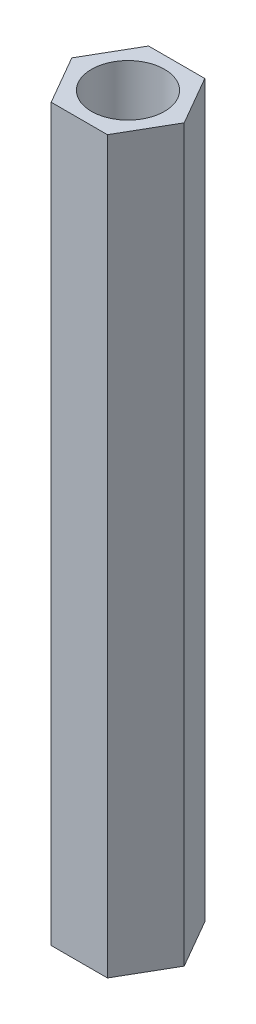
ISO-10303-21;
HEADER;
FILE_DESCRIPTION(('STEP AP214'),'2;1');
FILE_NAME('part.step','',(''),(''),'','','');
FILE_SCHEMA(('AUTOMOTIVE_DESIGN { 1 0 10303 214 1 1 1 1 }'));
ENDSEC;
DATA;
#1=APPLICATION_CONTEXT('core data for automotive mechanical design processes');
#2=APPLICATION_PROTOCOL_DEFINITION('international standard','automotive_design',2000,#1);
#3=PRODUCT_CONTEXT('',#1,'mechanical');
#4=PRODUCT('Part','Part','',(#3));
#5=PRODUCT_RELATED_PRODUCT_CATEGORY('part','',(#4));
#6=PRODUCT_DEFINITION_FORMATION('','',#4);
#7=PRODUCT_DEFINITION_CONTEXT('part definition',#1,'design');
#8=PRODUCT_DEFINITION('design','',#6,#7);
#9=PRODUCT_DEFINITION_SHAPE('','',#8);
#10=(LENGTH_UNIT() NAMED_UNIT(*) SI_UNIT(.MILLI.,.METRE.));
#11=(NAMED_UNIT(*) PLANE_ANGLE_UNIT() SI_UNIT($,.RADIAN.));
#12=(NAMED_UNIT(*) SI_UNIT($,.STERADIAN.) SOLID_ANGLE_UNIT());
#13=UNCERTAINTY_MEASURE_WITH_UNIT(LENGTH_MEASURE(1.E-05),#10,'distance_accuracy_value','');
#14=(GEOMETRIC_REPRESENTATION_CONTEXT(3) GLOBAL_UNCERTAINTY_ASSIGNED_CONTEXT((#13)) GLOBAL_UNIT_ASSIGNED_CONTEXT((#10,
#11,#12)) REPRESENTATION_CONTEXT('',''));
#15=CARTESIAN_POINT('',(0.,0.,0.));
#16=DIRECTION('',(0.,0.,1.));
#17=DIRECTION('',(1.,0.,0.));
#18=AXIS2_PLACEMENT_3D('',#15,#16,#17);
#19=CARTESIAN_POINT('',(0.,30.,0.));
#20=DIRECTION('',(0.,1.,0.));
#21=DIRECTION('',(0.,0.,1.));
#22=AXIS2_PLACEMENT_3D('',#19,#20,#21);
#23=PLANE('',#22);
#24=DIRECTION('',(0.5,0.,-0.866025403784439));
#25=VECTOR('',#24,1.);
#26=CARTESIAN_POINT('',(1.15470053837925,30.,2.));
#27=LINE('',#26,#25);
#28=CARTESIAN_POINT('',(1.15470053837925,30.,2.));
#29=VERTEX_POINT('',#28);
#30=CARTESIAN_POINT('',(2.3094010767585,30.,0.));
#31=VERTEX_POINT('',#30);
#32=EDGE_CURVE('E133',#29,#31,#27,.T.);
#33=ORIENTED_EDGE('',*,*,#32,.T.);
#34=DIRECTION('',(-0.5,0.,-0.866025403784439));
#35=VECTOR('',#34,1.);
#36=CARTESIAN_POINT('',(2.3094010767585,30.,0.));
#37=LINE('',#36,#35);
#38=CARTESIAN_POINT('',(1.15470053837925,30.,-2.));
#39=VERTEX_POINT('',#38);
#40=EDGE_CURVE('E91',#31,#39,#37,.T.);
#41=ORIENTED_EDGE('',*,*,#40,.T.);
#42=DIRECTION('',(-1.,0.,0.));
#43=VECTOR('',#42,1.);
#44=CARTESIAN_POINT('',(1.15470053837925,30.,-2.));
#45=LINE('',#44,#43);
#46=CARTESIAN_POINT('',(-1.15470053837925,30.,-2.));
#47=VERTEX_POINT('',#46);
#48=EDGE_CURVE('E104',#39,#47,#45,.T.);
#49=ORIENTED_EDGE('',*,*,#48,.T.);
#50=DIRECTION('',(-0.5,0.,0.866025403784439));
#51=VECTOR('',#50,1.);
#52=CARTESIAN_POINT('',(-1.15470053837925,30.,-2.));
#53=LINE('',#52,#51);
#54=CARTESIAN_POINT('',(-2.3094010767585,30.,0.));
#55=VERTEX_POINT('',#54);
#56=EDGE_CURVE('E98',#47,#55,#53,.T.);
#57=ORIENTED_EDGE('',*,*,#56,.T.);
#58=DIRECTION('',(0.5,0.,0.866025403784439));
#59=VECTOR('',#58,1.);
#60=CARTESIAN_POINT('',(-2.3094010767585,30.,0.));
#61=LINE('',#60,#59);
#62=CARTESIAN_POINT('',(-1.15470053837925,30.,2.));
#63=VERTEX_POINT('',#62);
#64=EDGE_CURVE('E102',#55,#63,#61,.T.);
#65=ORIENTED_EDGE('',*,*,#64,.T.);
#66=DIRECTION('',(1.,0.,0.));
#67=VECTOR('',#66,1.);
#68=CARTESIAN_POINT('',(-1.15470053837925,30.,2.));
#69=LINE('',#68,#67);
#70=EDGE_CURVE('E54',#63,#29,#69,.T.);
#71=ORIENTED_EDGE('',*,*,#70,.T.);
#72=EDGE_LOOP('',(#33,#41,#49,#57,#65,#71));
#73=FACE_BOUND('',#72,.T.);
#74=CARTESIAN_POINT('',(0.,30.,0.));
#75=DIRECTION('',(0.,1.,0.));
#76=DIRECTION('',(0.,0.,1.));
#77=AXIS2_PLACEMENT_3D('',#74,#75,#76);
#78=CIRCLE('',#77,1.5);
#79=CARTESIAN_POINT('',(0.,30.,1.5));
#80=VERTEX_POINT('',#79);
#81=EDGE_CURVE('E126',#80,#80,#78,.T.);
#82=ORIENTED_EDGE('',*,*,#81,.F.);
#83=EDGE_LOOP('',(#82));
#84=FACE_BOUND('',#83,.T.);
#85=ADVANCED_FACE('F37',(#73,#84),#23,.T.);
#86=CARTESIAN_POINT('',(0.,0.,0.));
#87=DIRECTION('',(0.,1.,0.));
#88=DIRECTION('',(0.,0.,1.));
#89=AXIS2_PLACEMENT_3D('',#86,#87,#88);
#90=PLANE('',#89);
#91=DIRECTION('',(0.5,0.,-0.866025403784439));
#92=VECTOR('',#91,1.);
#93=CARTESIAN_POINT('',(1.15470053837925,0.,2.));
#94=LINE('',#93,#92);
#95=CARTESIAN_POINT('',(1.15470053837925,0.,2.));
#96=VERTEX_POINT('',#95);
#97=CARTESIAN_POINT('',(2.3094010767585,0.,0.));
#98=VERTEX_POINT('',#97);
#99=EDGE_CURVE('E122',#96,#98,#94,.T.);
#100=ORIENTED_EDGE('',*,*,#99,.F.);
#101=DIRECTION('',(1.,0.,0.));
#102=VECTOR('',#101,1.);
#103=CARTESIAN_POINT('',(-1.15470053837925,0.,2.));
#104=LINE('',#103,#102);
#105=CARTESIAN_POINT('',(-1.15470053837925,0.,2.));
#106=VERTEX_POINT('',#105);
#107=EDGE_CURVE('E83',#106,#96,#104,.T.);
#108=ORIENTED_EDGE('',*,*,#107,.F.);
#109=DIRECTION('',(0.5,0.,0.866025403784439));
#110=VECTOR('',#109,1.);
#111=CARTESIAN_POINT('',(-2.3094010767585,0.,0.));
#112=LINE('',#111,#110);
#113=CARTESIAN_POINT('',(-2.3094010767585,0.,0.));
#114=VERTEX_POINT('',#113);
#115=EDGE_CURVE('E77',#114,#106,#112,.T.);
#116=ORIENTED_EDGE('',*,*,#115,.F.);
#117=DIRECTION('',(-0.5,0.,0.866025403784439));
#118=VECTOR('',#117,1.);
#119=CARTESIAN_POINT('',(-1.15470053837925,0.,-2.));
#120=LINE('',#119,#118);
#121=CARTESIAN_POINT('',(-1.15470053837925,0.,-2.));
#122=VERTEX_POINT('',#121);
#123=EDGE_CURVE('E112',#122,#114,#120,.T.);
#124=ORIENTED_EDGE('',*,*,#123,.F.);
#125=DIRECTION('',(-1.,0.,0.));
#126=VECTOR('',#125,1.);
#127=CARTESIAN_POINT('',(1.15470053837925,0.,-2.));
#128=LINE('',#127,#126);
#129=CARTESIAN_POINT('',(1.15470053837925,0.,-2.));
#130=VERTEX_POINT('',#129);
#131=EDGE_CURVE('E128',#130,#122,#128,.T.);
#132=ORIENTED_EDGE('',*,*,#131,.F.);
#133=DIRECTION('',(-0.5,0.,-0.866025403784439));
#134=VECTOR('',#133,1.);
#135=CARTESIAN_POINT('',(2.3094010767585,0.,0.));
#136=LINE('',#135,#134);
#137=EDGE_CURVE('E125',#98,#130,#136,.T.);
#138=ORIENTED_EDGE('',*,*,#137,.F.);
#139=EDGE_LOOP('',(#100,#108,#116,#124,#132,#138));
#140=FACE_BOUND('',#139,.T.);
#141=CARTESIAN_POINT('',(0.,0.,0.));
#142=DIRECTION('',(0.,1.,0.));
#143=DIRECTION('',(0.,0.,1.));
#144=AXIS2_PLACEMENT_3D('',#141,#142,#143);
#145=CIRCLE('',#144,1.5);
#146=CARTESIAN_POINT('',(0.,0.,1.5));
#147=VERTEX_POINT('',#146);
#148=EDGE_CURVE('E226',#147,#147,#145,.T.);
#149=ORIENTED_EDGE('',*,*,#148,.T.);
#150=EDGE_LOOP('',(#149));
#151=FACE_BOUND('',#150,.T.);
#152=ADVANCED_FACE('F142',(#140,#151),#90,.F.);
#153=CARTESIAN_POINT('',(1.15470053837925,30.,2.));
#154=DIRECTION('',(-0.866025403784439,0.,-0.5));
#155=DIRECTION('',(-0.5,0.,0.866025403784439));
#156=AXIS2_PLACEMENT_3D('',#153,#154,#155);
#157=PLANE('',#156);
#158=ORIENTED_EDGE('',*,*,#99,.T.);
#159=DIRECTION('',(0.,-1.,0.));
#160=VECTOR('',#159,1.);
#161=CARTESIAN_POINT('',(2.3094010767585,30.,0.));
#162=LINE('',#161,#160);
#163=EDGE_CURVE('E11',#31,#98,#162,.T.);
#164=ORIENTED_EDGE('',*,*,#163,.F.);
#165=ORIENTED_EDGE('',*,*,#32,.F.);
#166=DIRECTION('',(0.,-1.,0.));
#167=VECTOR('',#166,1.);
#168=CARTESIAN_POINT('',(1.15470053837925,30.,2.));
#169=LINE('',#168,#167);
#170=EDGE_CURVE('E118',#29,#96,#169,.T.);
#171=ORIENTED_EDGE('',*,*,#170,.T.);
#172=EDGE_LOOP('',(#158,#164,#165,#171));
#173=FACE_BOUND('',#172,.T.);
#174=ADVANCED_FACE('F39',(#173),#157,.F.);
#175=CARTESIAN_POINT('',(2.3094010767585,30.,0.));
#176=DIRECTION('',(-0.866025403784439,0.,0.5));
#177=DIRECTION('',(0.5,0.,0.866025403784439));
#178=AXIS2_PLACEMENT_3D('',#175,#176,#177);
#179=PLANE('',#178);
#180=ORIENTED_EDGE('',*,*,#137,.T.);
#181=DIRECTION('',(0.,-1.,0.));
#182=VECTOR('',#181,1.);
#183=CARTESIAN_POINT('',(1.15470053837925,30.,-2.));
#184=LINE('',#183,#182);
#185=EDGE_CURVE('E46',#39,#130,#184,.T.);
#186=ORIENTED_EDGE('',*,*,#185,.F.);
#187=ORIENTED_EDGE('',*,*,#40,.F.);
#188=ORIENTED_EDGE('',*,*,#163,.T.);
#189=EDGE_LOOP('',(#180,#186,#187,#188));
#190=FACE_BOUND('',#189,.T.);
#191=ADVANCED_FACE('F167',(#190),#179,.F.);
#192=CARTESIAN_POINT('',(1.15470053837925,30.,-2.));
#193=DIRECTION('',(0.,0.,1.));
#194=DIRECTION('',(1.,0.,0.));
#195=AXIS2_PLACEMENT_3D('',#192,#193,#194);
#196=PLANE('',#195);
#197=ORIENTED_EDGE('',*,*,#131,.T.);
#198=DIRECTION('',(0.,-1.,0.));
#199=VECTOR('',#198,1.);
#200=CARTESIAN_POINT('',(-1.15470053837925,30.,-2.));
#201=LINE('',#200,#199);
#202=EDGE_CURVE('E113',#47,#122,#201,.T.);
#203=ORIENTED_EDGE('',*,*,#202,.F.);
#204=ORIENTED_EDGE('',*,*,#48,.F.);
#205=ORIENTED_EDGE('',*,*,#185,.T.);
#206=EDGE_LOOP('',(#197,#203,#204,#205));
#207=FACE_BOUND('',#206,.T.);
#208=ADVANCED_FACE('F139',(#207),#196,.F.);
#209=CARTESIAN_POINT('',(-1.15470053837925,30.,-2.));
#210=DIRECTION('',(0.866025403784439,0.,0.5));
#211=DIRECTION('',(0.5,0.,-0.866025403784439));
#212=AXIS2_PLACEMENT_3D('',#209,#210,#211);
#213=PLANE('',#212);
#214=ORIENTED_EDGE('',*,*,#123,.T.);
#215=DIRECTION('',(0.,-1.,0.));
#216=VECTOR('',#215,1.);
#217=CARTESIAN_POINT('',(-2.3094010767585,30.,0.));
#218=LINE('',#217,#216);
#219=EDGE_CURVE('E109',#55,#114,#218,.T.);
#220=ORIENTED_EDGE('',*,*,#219,.F.);
#221=ORIENTED_EDGE('',*,*,#56,.F.);
#222=ORIENTED_EDGE('',*,*,#202,.T.);
#223=EDGE_LOOP('',(#214,#220,#221,#222));
#224=FACE_BOUND('',#223,.T.);
#225=ADVANCED_FACE('F110',(#224),#213,.F.);
#226=CARTESIAN_POINT('',(-2.3094010767585,30.,0.));
#227=DIRECTION('',(0.866025403784439,0.,-0.5));
#228=DIRECTION('',(-0.5,0.,-0.866025403784439));
#229=AXIS2_PLACEMENT_3D('',#226,#227,#228);
#230=PLANE('',#229);
#231=ORIENTED_EDGE('',*,*,#115,.T.);
#232=DIRECTION('',(0.,-1.,0.));
#233=VECTOR('',#232,1.);
#234=CARTESIAN_POINT('',(-1.15470053837925,30.,2.));
#235=LINE('',#234,#233);
#236=EDGE_CURVE('E114',#63,#106,#235,.T.);
#237=ORIENTED_EDGE('',*,*,#236,.F.);
#238=ORIENTED_EDGE('',*,*,#64,.F.);
#239=ORIENTED_EDGE('',*,*,#219,.T.);
#240=EDGE_LOOP('',(#231,#237,#238,#239));
#241=FACE_BOUND('',#240,.T.);
#242=ADVANCED_FACE('F116',(#241),#230,.F.);
#243=CARTESIAN_POINT('',(-1.15470053837925,30.,2.));
#244=DIRECTION('',(0.,0.,-1.));
#245=DIRECTION('',(-1.,0.,0.));
#246=AXIS2_PLACEMENT_3D('',#243,#244,#245);
#247=PLANE('',#246);
#248=ORIENTED_EDGE('',*,*,#107,.T.);
#249=ORIENTED_EDGE('',*,*,#170,.F.);
#250=ORIENTED_EDGE('',*,*,#70,.F.);
#251=ORIENTED_EDGE('',*,*,#236,.T.);
#252=EDGE_LOOP('',(#248,#249,#250,#251));
#253=FACE_BOUND('',#252,.T.);
#254=ADVANCED_FACE('F147',(#253),#247,.F.);
#255=CARTESIAN_POINT('',(0.,30.,0.));
#256=DIRECTION('',(0.,-1.,0.));
#257=DIRECTION('',(0.,0.,-1.));
#258=AXIS2_PLACEMENT_3D('',#255,#256,#257);
#259=CYLINDRICAL_SURFACE('',#258,1.5);
#260=ORIENTED_EDGE('',*,*,#81,.T.);
#261=EDGE_LOOP('',(#260));
#262=FACE_BOUND('',#261,.T.);
#263=ORIENTED_EDGE('',*,*,#148,.F.);
#264=EDGE_LOOP('',(#263));
#265=FACE_BOUND('',#264,.T.);
#266=ADVANCED_FACE('F149',(#262,#265),#259,.F.);
#267=CLOSED_SHELL('',(#85,#152,#174,#191,#208,#225,#242,#254,#266));
#268=MANIFOLD_SOLID_BREP('B2',#267);
#269=ADVANCED_BREP_SHAPE_REPRESENTATION('',(#18,#268),#14);
#270=SHAPE_DEFINITION_REPRESENTATION(#9,#269);
ENDSEC;
END-ISO-10303-21;
